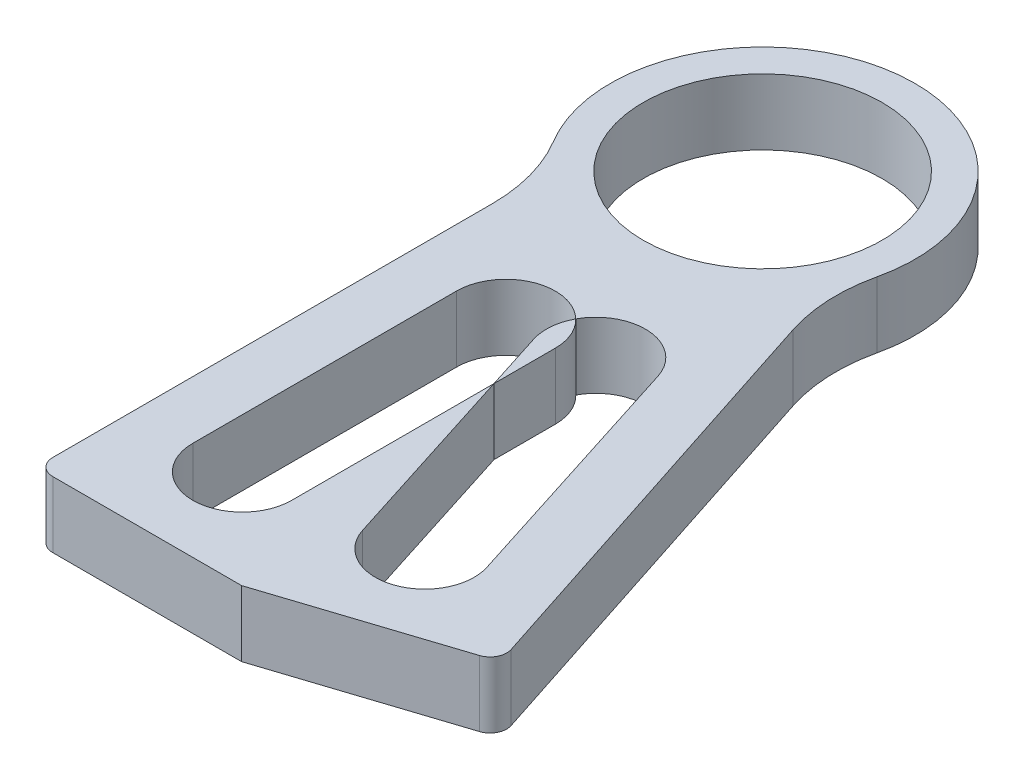
ISO-10303-21;
HEADER;
FILE_DESCRIPTION(('STEP AP214'),'2;1');
FILE_NAME('part.step','',(''),(''),'','','');
FILE_SCHEMA(('AUTOMOTIVE_DESIGN { 1 0 10303 214 1 1 1 1 }'));
ENDSEC;
DATA;
#1=APPLICATION_CONTEXT('core data for automotive mechanical design processes');
#2=APPLICATION_PROTOCOL_DEFINITION('international standard','automotive_design',2000,#1);
#3=PRODUCT_CONTEXT('',#1,'mechanical');
#4=PRODUCT('Part','Part','',(#3));
#5=PRODUCT_RELATED_PRODUCT_CATEGORY('part','',(#4));
#6=PRODUCT_DEFINITION_FORMATION('','',#4);
#7=PRODUCT_DEFINITION_CONTEXT('part definition',#1,'design');
#8=PRODUCT_DEFINITION('design','',#6,#7);
#9=PRODUCT_DEFINITION_SHAPE('','',#8);
#10=(LENGTH_UNIT() NAMED_UNIT(*) SI_UNIT(.MILLI.,.METRE.));
#11=(NAMED_UNIT(*) PLANE_ANGLE_UNIT() SI_UNIT($,.RADIAN.));
#12=(NAMED_UNIT(*) SI_UNIT($,.STERADIAN.) SOLID_ANGLE_UNIT());
#13=UNCERTAINTY_MEASURE_WITH_UNIT(LENGTH_MEASURE(1.E-05),#10,'distance_accuracy_value','');
#14=(GEOMETRIC_REPRESENTATION_CONTEXT(3) GLOBAL_UNCERTAINTY_ASSIGNED_CONTEXT((#13)) GLOBAL_UNIT_ASSIGNED_CONTEXT((#10,
#11,#12)) REPRESENTATION_CONTEXT('',''));
#15=CARTESIAN_POINT('',(0.,0.,0.));
#16=DIRECTION('',(0.,0.,1.));
#17=DIRECTION('',(1.,0.,0.));
#18=AXIS2_PLACEMENT_3D('',#15,#16,#17);
#19=CARTESIAN_POINT('',(0.,6.35,0.));
#20=DIRECTION('',(0.,1.,0.));
#21=DIRECTION('',(0.,0.,1.));
#22=AXIS2_PLACEMENT_3D('',#19,#20,#21);
#23=PLANE('',#22);
#24=CARTESIAN_POINT('',(7.50646694429382,6.35,23.567585157394));
#25=DIRECTION('',(0.,1.,0.));
#26=DIRECTION('',(0.,0.,1.));
#27=AXIS2_PLACEMENT_3D('',#24,#25,#26);
#28=CIRCLE('',#27,4.76250000000001);
#29=CARTESIAN_POINT('',(12.0443479640151,6.35,22.1222332622301));
#30=VERTEX_POINT('',#29);
#31=CARTESIAN_POINT('',(3.31186605310304,6.35,21.3122072259551));
#32=VERTEX_POINT('',#31);
#33=EDGE_CURVE('E246',#30,#32,#28,.T.);
#34=ORIENTED_EDGE('',*,*,#33,.F.);
#35=DIRECTION('',(0.303485962239136,0.,0.952835909652751));
#36=VECTOR('',#35,1.);
#37=CARTESIAN_POINT('',(4.53788101972123,6.35,-1.44535189516389));
#38=LINE('',#37,#36);
#39=CARTESIAN_POINT('',(19.7528914048891,6.35,46.32426536741));
#40=VERTEX_POINT('',#39);
#41=EDGE_CURVE('E248',#30,#40,#38,.T.);
#42=ORIENTED_EDGE('',*,*,#41,.T.);
#43=CARTESIAN_POINT('',(15.2150103851679,6.35,47.7696172625739));
#44=DIRECTION('',(0.,1.,0.));
#45=DIRECTION('',(0.,0.,1.));
#46=AXIS2_PLACEMENT_3D('',#43,#44,#45);
#47=CIRCLE('',#46,4.76250000000001);
#48=CARTESIAN_POINT('',(10.6771293654467,6.35,49.2149691577378));
#49=VERTEX_POINT('',#48);
#50=EDGE_CURVE('E242',#49,#40,#47,.T.);
#51=ORIENTED_EDGE('',*,*,#50,.F.);
#52=DIRECTION('',(0.303485962239136,0.,0.952835909652751));
#53=VECTOR('',#52,1.);
#54=CARTESIAN_POINT('',(-4.53788101972123,6.35,1.44535189516389));
#55=LINE('',#54,#53);
#56=CARTESIAN_POINT('',(4.7625,6.35,30.6451769666791));
#57=VERTEX_POINT('',#56);
#58=EDGE_CURVE('E245',#57,#49,#55,.T.);
#59=ORIENTED_EDGE('',*,*,#58,.F.);
#60=DIRECTION('',(0.,0.,1.));
#61=VECTOR('',#60,1.);
#62=CARTESIAN_POINT('',(4.7625,6.35,0.));
#63=LINE('',#62,#61);
#64=CARTESIAN_POINT('',(4.7625,6.35,50.1346258877065));
#65=VERTEX_POINT('',#64);
#66=EDGE_CURVE('E251',#57,#65,#63,.T.);
#67=ORIENTED_EDGE('',*,*,#66,.T.);
#68=CARTESIAN_POINT('',(0.,6.35,50.1346258877065));
#69=DIRECTION('',(0.,1.,0.));
#70=DIRECTION('',(0.,0.,1.));
#71=AXIS2_PLACEMENT_3D('',#68,#69,#70);
#72=CIRCLE('',#71,4.7625);
#73=CARTESIAN_POINT('',(-4.7625,6.35,50.1346258877065));
#74=VERTEX_POINT('',#73);
#75=EDGE_CURVE('E219',#74,#65,#72,.T.);
#76=ORIENTED_EDGE('',*,*,#75,.F.);
#77=DIRECTION('',(0.,0.,-1.));
#78=VECTOR('',#77,1.);
#79=CARTESIAN_POINT('',(-4.7625,6.35,0.));
#80=LINE('',#79,#78);
#81=CARTESIAN_POINT('',(-4.7625,6.35,24.7346258877065));
#82=VERTEX_POINT('',#81);
#83=EDGE_CURVE('E215',#74,#82,#80,.T.);
#84=ORIENTED_EDGE('',*,*,#83,.T.);
#85=CARTESIAN_POINT('',(0.,6.35,24.7346258877065));
#86=DIRECTION('',(0.,1.,0.));
#87=DIRECTION('',(0.,0.,1.));
#88=AXIS2_PLACEMENT_3D('',#85,#86,#87);
#89=CIRCLE('',#88,4.7625);
#90=EDGE_CURVE('E236',#32,#82,#89,.T.);
#91=ORIENTED_EDGE('',*,*,#90,.F.);
#92=EDGE_LOOP('',(#34,#42,#51,#59,#67,#76,#84,#91));
#93=FACE_BOUND('',#92,.T.);
#94=CARTESIAN_POINT('',(0.,6.35,0.));
#95=DIRECTION('',(0.,1.,0.));
#96=DIRECTION('',(0.,0.,1.));
#97=AXIS2_PLACEMENT_3D('',#94,#95,#96);
#98=CIRCLE('',#97,11.5062);
#99=CARTESIAN_POINT('',(0.,6.35,11.5062));
#100=VERTEX_POINT('',#99);
#101=EDGE_CURVE('E290',#100,#100,#98,.T.);
#102=ORIENTED_EDGE('',*,*,#101,.F.);
#103=EDGE_LOOP('',(#102));
#104=FACE_BOUND('',#103,.T.);
#105=CARTESIAN_POINT('',(0.,6.35,0.));
#106=DIRECTION('',(0.,1.,0.));
#107=DIRECTION('',(0.,0.,1.));
#108=AXIS2_PLACEMENT_3D('',#105,#106,#107);
#109=CIRCLE('',#108,14.6812);
#110=CARTESIAN_POINT('',(14.3078167650456,6.35,3.28998675649024));
#111=VERTEX_POINT('',#110);
#112=CARTESIAN_POINT('',(-12.5882442227764,6.35,7.55471646243172));
#113=VERTEX_POINT('',#112);
#114=EDGE_CURVE('E288',#111,#113,#109,.T.);
#115=ORIENTED_EDGE('',*,*,#114,.T.);
#116=CARTESIAN_POINT('',(-26.2001,6.35,15.723743779075));
#117=DIRECTION('',(0.,1.,0.));
#118=DIRECTION('',(0.,0.,1.));
#119=AXIS2_PLACEMENT_3D('',#116,#117,#118);
#120=CIRCLE('',#119,15.875);
#121=CARTESIAN_POINT('',(-10.3251,6.35,15.723743779075));
#122=VERTEX_POINT('',#121);
#123=EDGE_CURVE('E297',#113,#122,#120,.F.);
#124=ORIENTED_EDGE('',*,*,#123,.T.);
#125=DIRECTION('',(0.,0.,1.));
#126=VECTOR('',#125,1.);
#127=CARTESIAN_POINT('',(-10.3251,6.35,0.));
#128=LINE('',#127,#126);
#129=CARTESIAN_POINT('',(-10.3251,6.35,58.0594258877065));
#130=VERTEX_POINT('',#129);
#131=EDGE_CURVE('E298',#122,#130,#128,.T.);
#132=ORIENTED_EDGE('',*,*,#131,.T.);
#133=CARTESIAN_POINT('',(-8.7249,6.35,58.0594258877065));
#134=DIRECTION('',(0.,1.,0.));
#135=DIRECTION('',(0.,0.,1.));
#136=AXIS2_PLACEMENT_3D('',#133,#134,#135);
#137=CIRCLE('',#136,1.6002);
#138=CARTESIAN_POINT('',(-8.7249,6.35,59.6596258877065));
#139=VERTEX_POINT('',#138);
#140=EDGE_CURVE('E300',#130,#139,#137,.T.);
#141=ORIENTED_EDGE('',*,*,#140,.T.);
#142=DIRECTION('',(1.,0.,0.));
#143=VECTOR('',#142,1.);
#144=CARTESIAN_POINT('',(0.,6.35,59.6596258877065));
#145=LINE('',#144,#143);
#146=CARTESIAN_POINT('',(9.459830418684,6.35,59.6596258877065));
#147=VERTEX_POINT('',#146);
#148=EDGE_CURVE('E301',#139,#147,#145,.T.);
#149=ORIENTED_EDGE('',*,*,#148,.T.);
#150=DIRECTION('',(-0.950948591075739,0.,0.309348956893453));
#151=VECTOR('',#150,1.);
#152=CARTESIAN_POINT('',(18.4556430267213,6.35,56.733237150375));
#153=LINE('',#152,#151);
#154=CARTESIAN_POINT('',(26.7525743889979,6.35,54.0341984363753));
#155=VERTEX_POINT('',#154);
#156=EDGE_CURVE('E305',#155,#147,#153,.T.);
#157=ORIENTED_EDGE('',*,*,#156,.F.);
#158=CARTESIAN_POINT('',(26.257554188177,6.35,52.5124905009359));
#159=DIRECTION('',(0.,1.,0.));
#160=DIRECTION('',(0.,0.,1.));
#161=AXIS2_PLACEMENT_3D('',#158,#159,#160);
#162=CIRCLE('',#161,1.6002);
#163=CARTESIAN_POINT('',(27.7792621236164,6.35,52.017470300115));
#164=VERTEX_POINT('',#163);
#165=EDGE_CURVE('E304',#155,#164,#162,.T.);
#166=ORIENTED_EDGE('',*,*,#165,.T.);
#167=DIRECTION('',(0.309348956893452,0.,0.950948591075739));
#168=VECTOR('',#167,1.);
#169=CARTESIAN_POINT('',(9.81863929771612,6.35,-3.19405891482058));
#170=LINE('',#169,#168);
#171=CARTESIAN_POINT('',(14.6827630342329,6.35,11.7584130783267));
#172=VERTEX_POINT('',#171);
#173=EDGE_CURVE('E282',#172,#164,#170,.T.);
#174=ORIENTED_EDGE('',*,*,#173,.F.);
#175=CARTESIAN_POINT('',(29.7790719175602,6.35,6.84749838764318));
#176=DIRECTION('',(0.,1.,0.));
#177=DIRECTION('',(0.,0.,1.));
#178=AXIS2_PLACEMENT_3D('',#175,#176,#177);
#179=CIRCLE('',#178,15.875);
#180=EDGE_CURVE('E338',#172,#111,#179,.F.);
#181=ORIENTED_EDGE('',*,*,#180,.T.);
#182=EDGE_LOOP('',(#115,#124,#132,#141,#149,#157,#166,#174,#181));
#183=FACE_BOUND('',#182,.T.);
#184=ADVANCED_FACE('F85',(#93,#104,#183),#23,.T.);
#185=CARTESIAN_POINT('',(0.,0.,0.));
#186=DIRECTION('',(0.,1.,0.));
#187=DIRECTION('',(0.,0.,1.));
#188=AXIS2_PLACEMENT_3D('',#185,#186,#187);
#189=PLANE('',#188);
#190=DIRECTION('',(1.,0.,0.));
#191=VECTOR('',#190,1.);
#192=CARTESIAN_POINT('',(0.,0.,59.6596258877065));
#193=LINE('',#192,#191);
#194=CARTESIAN_POINT('',(-8.7249,0.,59.6596258877065));
#195=VERTEX_POINT('',#194);
#196=CARTESIAN_POINT('',(9.459830418684,0.,59.6596258877065));
#197=VERTEX_POINT('',#196);
#198=EDGE_CURVE('E320',#195,#197,#193,.T.);
#199=ORIENTED_EDGE('',*,*,#198,.F.);
#200=CARTESIAN_POINT('',(-8.7249,0.,58.0594258877065));
#201=DIRECTION('',(0.,1.,0.));
#202=DIRECTION('',(0.,0.,1.));
#203=AXIS2_PLACEMENT_3D('',#200,#201,#202);
#204=CIRCLE('',#203,1.6002);
#205=CARTESIAN_POINT('',(-10.3251,0.,58.0594258877065));
#206=VERTEX_POINT('',#205);
#207=EDGE_CURVE('E334',#195,#206,#204,.F.);
#208=ORIENTED_EDGE('',*,*,#207,.T.);
#209=DIRECTION('',(0.,0.,1.));
#210=VECTOR('',#209,1.);
#211=CARTESIAN_POINT('',(-10.3251,0.,0.));
#212=LINE('',#211,#210);
#213=CARTESIAN_POINT('',(-10.3251,0.,15.723743779075));
#214=VERTEX_POINT('',#213);
#215=EDGE_CURVE('E316',#214,#206,#212,.T.);
#216=ORIENTED_EDGE('',*,*,#215,.F.);
#217=CARTESIAN_POINT('',(-26.2001,0.,15.723743779075));
#218=DIRECTION('',(0.,1.,0.));
#219=DIRECTION('',(0.,0.,1.));
#220=AXIS2_PLACEMENT_3D('',#217,#218,#219);
#221=CIRCLE('',#220,15.875);
#222=CARTESIAN_POINT('',(-12.5882442227764,0.,7.55471646243172));
#223=VERTEX_POINT('',#222);
#224=EDGE_CURVE('E337',#214,#223,#221,.T.);
#225=ORIENTED_EDGE('',*,*,#224,.T.);
#226=CARTESIAN_POINT('',(0.,0.,0.));
#227=DIRECTION('',(0.,1.,0.));
#228=DIRECTION('',(0.,0.,1.));
#229=AXIS2_PLACEMENT_3D('',#226,#227,#228);
#230=CIRCLE('',#229,14.6812);
#231=CARTESIAN_POINT('',(14.3078167650456,0.,3.28998675649024));
#232=VERTEX_POINT('',#231);
#233=EDGE_CURVE('E312',#232,#223,#230,.T.);
#234=ORIENTED_EDGE('',*,*,#233,.F.);
#235=CARTESIAN_POINT('',(29.7790719175602,0.,6.84749838764318));
#236=DIRECTION('',(0.,1.,0.));
#237=DIRECTION('',(0.,0.,1.));
#238=AXIS2_PLACEMENT_3D('',#235,#236,#237);
#239=CIRCLE('',#238,15.875);
#240=CARTESIAN_POINT('',(14.6827630342329,0.,11.7584130783267));
#241=VERTEX_POINT('',#240);
#242=EDGE_CURVE('E328',#232,#241,#239,.T.);
#243=ORIENTED_EDGE('',*,*,#242,.T.);
#244=DIRECTION('',(0.309348956893452,0.,0.950948591075739));
#245=VECTOR('',#244,1.);
#246=CARTESIAN_POINT('',(9.81863929771612,0.,-3.19405891482058));
#247=LINE('',#246,#245);
#248=CARTESIAN_POINT('',(27.7792621236164,0.,52.017470300115));
#249=VERTEX_POINT('',#248);
#250=EDGE_CURVE('E326',#241,#249,#247,.T.);
#251=ORIENTED_EDGE('',*,*,#250,.T.);
#252=CARTESIAN_POINT('',(26.257554188177,0.,52.5124905009359));
#253=DIRECTION('',(0.,1.,0.));
#254=DIRECTION('',(0.,0.,1.));
#255=AXIS2_PLACEMENT_3D('',#252,#253,#254);
#256=CIRCLE('',#255,1.6002);
#257=CARTESIAN_POINT('',(26.7525743889979,0.,54.0341984363753));
#258=VERTEX_POINT('',#257);
#259=EDGE_CURVE('E325',#249,#258,#256,.F.);
#260=ORIENTED_EDGE('',*,*,#259,.T.);
#261=DIRECTION('',(-0.950948591075739,0.,0.309348956893453));
#262=VECTOR('',#261,1.);
#263=CARTESIAN_POINT('',(18.4556430267213,0.,56.733237150375));
#264=LINE('',#263,#262);
#265=EDGE_CURVE('E311',#258,#197,#264,.T.);
#266=ORIENTED_EDGE('',*,*,#265,.T.);
#267=EDGE_LOOP('',(#199,#208,#216,#225,#234,#243,#251,#260,#266));
#268=FACE_BOUND('',#267,.T.);
#269=CARTESIAN_POINT('',(0.,0.,0.));
#270=DIRECTION('',(0.,1.,0.));
#271=DIRECTION('',(0.,0.,1.));
#272=AXIS2_PLACEMENT_3D('',#269,#270,#271);
#273=CIRCLE('',#272,11.5062);
#274=CARTESIAN_POINT('',(0.,0.,11.5062));
#275=VERTEX_POINT('',#274);
#276=EDGE_CURVE('E256',#275,#275,#273,.T.);
#277=ORIENTED_EDGE('',*,*,#276,.T.);
#278=EDGE_LOOP('',(#277));
#279=FACE_BOUND('',#278,.T.);
#280=DIRECTION('',(0.303485962239136,0.,0.952835909652751));
#281=VECTOR('',#280,1.);
#282=CARTESIAN_POINT('',(4.53788101972123,0.,-1.44535189516389));
#283=LINE('',#282,#281);
#284=CARTESIAN_POINT('',(12.0443479640151,0.,22.1222332622301));
#285=VERTEX_POINT('',#284);
#286=CARTESIAN_POINT('',(19.7528914048891,0.,46.32426536741));
#287=VERTEX_POINT('',#286);
#288=EDGE_CURVE('E94',#285,#287,#283,.T.);
#289=ORIENTED_EDGE('',*,*,#288,.F.);
#290=CARTESIAN_POINT('',(7.50646694429382,0.,23.567585157394));
#291=DIRECTION('',(0.,1.,0.));
#292=DIRECTION('',(0.,0.,1.));
#293=AXIS2_PLACEMENT_3D('',#290,#291,#292);
#294=CIRCLE('',#293,4.76250000000001);
#295=CARTESIAN_POINT('',(3.31186605310304,0.,21.3122072259551));
#296=VERTEX_POINT('',#295);
#297=EDGE_CURVE('E241',#285,#296,#294,.T.);
#298=ORIENTED_EDGE('',*,*,#297,.T.);
#299=CARTESIAN_POINT('',(0.,0.,24.7346258877065));
#300=DIRECTION('',(0.,1.,0.));
#301=DIRECTION('',(0.,0.,1.));
#302=AXIS2_PLACEMENT_3D('',#299,#300,#301);
#303=CIRCLE('',#302,4.7625);
#304=CARTESIAN_POINT('',(-4.7625,0.,24.7346258877065));
#305=VERTEX_POINT('',#304);
#306=EDGE_CURVE('E229',#296,#305,#303,.T.);
#307=ORIENTED_EDGE('',*,*,#306,.T.);
#308=DIRECTION('',(0.,0.,-1.));
#309=VECTOR('',#308,1.);
#310=CARTESIAN_POINT('',(-4.7625,0.,0.));
#311=LINE('',#310,#309);
#312=CARTESIAN_POINT('',(-4.7625,0.,50.1346258877065));
#313=VERTEX_POINT('',#312);
#314=EDGE_CURVE('E212',#313,#305,#311,.T.);
#315=ORIENTED_EDGE('',*,*,#314,.F.);
#316=CARTESIAN_POINT('',(0.,0.,50.1346258877065));
#317=DIRECTION('',(0.,1.,0.));
#318=DIRECTION('',(0.,0.,1.));
#319=AXIS2_PLACEMENT_3D('',#316,#317,#318);
#320=CIRCLE('',#319,4.7625);
#321=CARTESIAN_POINT('',(4.7625,0.,50.1346258877065));
#322=VERTEX_POINT('',#321);
#323=EDGE_CURVE('E223',#313,#322,#320,.T.);
#324=ORIENTED_EDGE('',*,*,#323,.T.);
#325=DIRECTION('',(0.,0.,1.));
#326=VECTOR('',#325,1.);
#327=CARTESIAN_POINT('',(4.7625,0.,0.));
#328=LINE('',#327,#326);
#329=CARTESIAN_POINT('',(4.7625,0.,30.6451769666791));
#330=VERTEX_POINT('',#329);
#331=EDGE_CURVE('E278',#330,#322,#328,.T.);
#332=ORIENTED_EDGE('',*,*,#331,.F.);
#333=DIRECTION('',(0.303485962239136,0.,0.952835909652751));
#334=VECTOR('',#333,1.);
#335=CARTESIAN_POINT('',(-4.53788101972123,0.,1.44535189516389));
#336=LINE('',#335,#334);
#337=CARTESIAN_POINT('',(10.6771293654467,0.,49.2149691577378));
#338=VERTEX_POINT('',#337);
#339=EDGE_CURVE('E228',#330,#338,#336,.T.);
#340=ORIENTED_EDGE('',*,*,#339,.T.);
#341=CARTESIAN_POINT('',(15.2150103851679,0.,47.7696172625739));
#342=DIRECTION('',(0.,1.,0.));
#343=DIRECTION('',(0.,0.,1.));
#344=AXIS2_PLACEMENT_3D('',#341,#342,#343);
#345=CIRCLE('',#344,4.76250000000001);
#346=EDGE_CURVE('E258',#338,#287,#345,.T.);
#347=ORIENTED_EDGE('',*,*,#346,.T.);
#348=EDGE_LOOP('',(#289,#298,#307,#315,#324,#332,#340,#347));
#349=FACE_BOUND('',#348,.T.);
#350=ADVANCED_FACE('F232',(#268,#279,#349),#189,.F.);
#351=CARTESIAN_POINT('',(0.,6.35,0.));
#352=DIRECTION('',(0.,-1.,0.));
#353=DIRECTION('',(0.,0.,-1.));
#354=AXIS2_PLACEMENT_3D('',#351,#352,#353);
#355=CYLINDRICAL_SURFACE('',#354,14.6812);
#356=ORIENTED_EDGE('',*,*,#114,.F.);
#357=DIRECTION('',(0.,-1.,0.));
#358=VECTOR('',#357,1.);
#359=CARTESIAN_POINT('',(14.3078167650456,6.35,3.28998675649024));
#360=LINE('',#359,#358);
#361=EDGE_CURVE('E261',#111,#232,#360,.T.);
#362=ORIENTED_EDGE('',*,*,#361,.T.);
#363=ORIENTED_EDGE('',*,*,#233,.T.);
#364=DIRECTION('',(0.,-1.,0.));
#365=VECTOR('',#364,1.);
#366=CARTESIAN_POINT('',(-12.5882442227764,6.35,7.55471646243172));
#367=LINE('',#366,#365);
#368=EDGE_CURVE('E315',#223,#113,#367,.F.);
#369=ORIENTED_EDGE('',*,*,#368,.T.);
#370=EDGE_LOOP('',(#356,#362,#363,#369));
#371=FACE_BOUND('',#370,.T.);
#372=ADVANCED_FACE('F372',(#371),#355,.T.);
#373=CARTESIAN_POINT('',(-10.3251,6.35,0.));
#374=DIRECTION('',(1.,0.,0.));
#375=DIRECTION('',(0.,0.,-1.));
#376=AXIS2_PLACEMENT_3D('',#373,#374,#375);
#377=PLANE('',#376);
#378=ORIENTED_EDGE('',*,*,#131,.F.);
#379=DIRECTION('',(0.,1.,0.));
#380=VECTOR('',#379,1.);
#381=CARTESIAN_POINT('',(-10.3251,0.,15.723743779075));
#382=LINE('',#381,#380);
#383=EDGE_CURVE('E319',#122,#214,#382,.F.);
#384=ORIENTED_EDGE('',*,*,#383,.T.);
#385=ORIENTED_EDGE('',*,*,#215,.T.);
#386=DIRECTION('',(0.,-1.,0.));
#387=VECTOR('',#386,1.);
#388=CARTESIAN_POINT('',(-10.3251,6.35,58.0594258877065));
#389=LINE('',#388,#387);
#390=EDGE_CURVE('E318',#206,#130,#389,.F.);
#391=ORIENTED_EDGE('',*,*,#390,.T.);
#392=EDGE_LOOP('',(#378,#384,#385,#391));
#393=FACE_BOUND('',#392,.T.);
#394=ADVANCED_FACE('F362',(#393),#377,.F.);
#395=CARTESIAN_POINT('',(0.,6.35,59.6596258877065));
#396=DIRECTION('',(0.,0.,-1.));
#397=DIRECTION('',(-1.,0.,0.));
#398=AXIS2_PLACEMENT_3D('',#395,#396,#397);
#399=PLANE('',#398);
#400=ORIENTED_EDGE('',*,*,#148,.F.);
#401=DIRECTION('',(0.,-1.,0.));
#402=VECTOR('',#401,1.);
#403=CARTESIAN_POINT('',(-8.7249,6.35,59.6596258877065));
#404=LINE('',#403,#402);
#405=EDGE_CURVE('E323',#139,#195,#404,.T.);
#406=ORIENTED_EDGE('',*,*,#405,.T.);
#407=ORIENTED_EDGE('',*,*,#198,.T.);
#408=DIRECTION('',(0.,-1.,0.));
#409=VECTOR('',#408,1.);
#410=CARTESIAN_POINT('',(9.459830418684,6.35,59.6596258877065));
#411=LINE('',#410,#409);
#412=EDGE_CURVE('E294',#147,#197,#411,.T.);
#413=ORIENTED_EDGE('',*,*,#412,.F.);
#414=EDGE_LOOP('',(#400,#406,#407,#413));
#415=FACE_BOUND('',#414,.T.);
#416=ADVANCED_FACE('F395',(#415),#399,.F.);
#417=CARTESIAN_POINT('',(18.4556430267213,6.35,56.733237150375));
#418=DIRECTION('',(0.309348956893453,0.,0.950948591075739));
#419=DIRECTION('',(0.950948591075739,0.,-0.309348956893453));
#420=AXIS2_PLACEMENT_3D('',#417,#418,#419);
#421=PLANE('',#420);
#422=ORIENTED_EDGE('',*,*,#265,.F.);
#423=DIRECTION('',(0.,-1.,0.));
#424=VECTOR('',#423,1.);
#425=CARTESIAN_POINT('',(26.7525743889979,6.35,54.0341984363753));
#426=LINE('',#425,#424);
#427=EDGE_CURVE('E307',#258,#155,#426,.F.);
#428=ORIENTED_EDGE('',*,*,#427,.T.);
#429=ORIENTED_EDGE('',*,*,#156,.T.);
#430=ORIENTED_EDGE('',*,*,#412,.T.);
#431=EDGE_LOOP('',(#422,#428,#429,#430));
#432=FACE_BOUND('',#431,.T.);
#433=ADVANCED_FACE('F390',(#432),#421,.T.);
#434=CARTESIAN_POINT('',(0.,6.35,0.));
#435=DIRECTION('',(0.,-1.,0.));
#436=DIRECTION('',(0.,0.,-1.));
#437=AXIS2_PLACEMENT_3D('',#434,#435,#436);
#438=CYLINDRICAL_SURFACE('',#437,11.5062);
#439=ORIENTED_EDGE('',*,*,#101,.T.);
#440=EDGE_LOOP('',(#439));
#441=FACE_BOUND('',#440,.T.);
#442=ORIENTED_EDGE('',*,*,#276,.F.);
#443=EDGE_LOOP('',(#442));
#444=FACE_BOUND('',#443,.T.);
#445=ADVANCED_FACE('F406',(#441,#444),#438,.F.);
#446=CARTESIAN_POINT('',(9.81863929771612,6.35,-3.19405891482058));
#447=DIRECTION('',(0.950948591075739,0.,-0.309348956893452));
#448=DIRECTION('',(-0.309348956893452,0.,-0.950948591075739));
#449=AXIS2_PLACEMENT_3D('',#446,#447,#448);
#450=PLANE('',#449);
#451=ORIENTED_EDGE('',*,*,#250,.F.);
#452=DIRECTION('',(0.,-1.,0.));
#453=VECTOR('',#452,1.);
#454=CARTESIAN_POINT('',(14.6827630342329,6.35,11.7584130783267));
#455=LINE('',#454,#453);
#456=EDGE_CURVE('E293',#241,#172,#455,.F.);
#457=ORIENTED_EDGE('',*,*,#456,.T.);
#458=ORIENTED_EDGE('',*,*,#173,.T.);
#459=DIRECTION('',(0.,-1.,0.));
#460=VECTOR('',#459,1.);
#461=CARTESIAN_POINT('',(27.7792621236164,6.35,52.017470300115));
#462=LINE('',#461,#460);
#463=EDGE_CURVE('E279',#164,#249,#462,.T.);
#464=ORIENTED_EDGE('',*,*,#463,.T.);
#465=EDGE_LOOP('',(#451,#457,#458,#464));
#466=FACE_BOUND('',#465,.T.);
#467=ADVANCED_FACE('F381',(#466),#450,.T.);
#468=CARTESIAN_POINT('',(-8.7249,6.35,58.0594258877065));
#469=DIRECTION('',(0.,-1.,0.));
#470=DIRECTION('',(0.,0.,-1.));
#471=AXIS2_PLACEMENT_3D('',#468,#469,#470);
#472=CYLINDRICAL_SURFACE('',#471,1.6002);
#473=ORIENTED_EDGE('',*,*,#140,.F.);
#474=ORIENTED_EDGE('',*,*,#390,.F.);
#475=ORIENTED_EDGE('',*,*,#207,.F.);
#476=ORIENTED_EDGE('',*,*,#405,.F.);
#477=EDGE_LOOP('',(#473,#474,#475,#476));
#478=FACE_BOUND('',#477,.T.);
#479=ADVANCED_FACE('F398',(#478),#472,.T.);
#480=CARTESIAN_POINT('',(26.257554188177,6.35,52.5124905009359));
#481=DIRECTION('',(0.,-1.,0.));
#482=DIRECTION('',(0.,0.,-1.));
#483=AXIS2_PLACEMENT_3D('',#480,#481,#482);
#484=CYLINDRICAL_SURFACE('',#483,1.6002);
#485=ORIENTED_EDGE('',*,*,#165,.F.);
#486=ORIENTED_EDGE('',*,*,#427,.F.);
#487=ORIENTED_EDGE('',*,*,#259,.F.);
#488=ORIENTED_EDGE('',*,*,#463,.F.);
#489=EDGE_LOOP('',(#485,#486,#487,#488));
#490=FACE_BOUND('',#489,.T.);
#491=ADVANCED_FACE('F386',(#490),#484,.T.);
#492=CARTESIAN_POINT('',(29.7790719175602,6.35,6.84749838764318));
#493=DIRECTION('',(0.,-1.,0.));
#494=DIRECTION('',(0.,0.,-1.));
#495=AXIS2_PLACEMENT_3D('',#492,#493,#494);
#496=CYLINDRICAL_SURFACE('',#495,15.875);
#497=ORIENTED_EDGE('',*,*,#180,.F.);
#498=ORIENTED_EDGE('',*,*,#456,.F.);
#499=ORIENTED_EDGE('',*,*,#242,.F.);
#500=ORIENTED_EDGE('',*,*,#361,.F.);
#501=EDGE_LOOP('',(#497,#498,#499,#500));
#502=FACE_BOUND('',#501,.T.);
#503=ADVANCED_FACE('F376',(#502),#496,.F.);
#504=CARTESIAN_POINT('',(-26.2001,6.35,15.723743779075));
#505=DIRECTION('',(0.,-1.,0.));
#506=DIRECTION('',(0.,0.,-1.));
#507=AXIS2_PLACEMENT_3D('',#504,#505,#506);
#508=CYLINDRICAL_SURFACE('',#507,15.875);
#509=ORIENTED_EDGE('',*,*,#123,.F.);
#510=ORIENTED_EDGE('',*,*,#368,.F.);
#511=ORIENTED_EDGE('',*,*,#224,.F.);
#512=ORIENTED_EDGE('',*,*,#383,.F.);
#513=EDGE_LOOP('',(#509,#510,#511,#512));
#514=FACE_BOUND('',#513,.T.);
#515=ADVANCED_FACE('F366',(#514),#508,.F.);
#516=CARTESIAN_POINT('',(4.7625,0.,0.));
#517=DIRECTION('',(-1.,0.,0.));
#518=DIRECTION('',(0.,0.,1.));
#519=AXIS2_PLACEMENT_3D('',#516,#517,#518);
#520=PLANE('',#519);
#521=ORIENTED_EDGE('',*,*,#66,.F.);
#522=DIRECTION('',(0.,1.,0.));
#523=VECTOR('',#522,1.);
#524=CARTESIAN_POINT('',(4.7625,0.,30.6451769666791));
#525=LINE('',#524,#523);
#526=EDGE_CURVE('E253',#330,#57,#525,.T.);
#527=ORIENTED_EDGE('',*,*,#526,.F.);
#528=ORIENTED_EDGE('',*,*,#331,.T.);
#529=DIRECTION('',(0.,1.,0.));
#530=VECTOR('',#529,1.);
#531=CARTESIAN_POINT('',(4.7625,0.,50.1346258877065));
#532=LINE('',#531,#530);
#533=EDGE_CURVE('E225',#322,#65,#532,.T.);
#534=ORIENTED_EDGE('',*,*,#533,.T.);
#535=EDGE_LOOP('',(#521,#527,#528,#534));
#536=FACE_BOUND('',#535,.T.);
#537=ADVANCED_FACE('F271',(#536),#520,.T.);
#538=CARTESIAN_POINT('',(0.,0.,50.1346258877065));
#539=DIRECTION('',(0.,1.,0.));
#540=DIRECTION('',(0.,0.,1.));
#541=AXIS2_PLACEMENT_3D('',#538,#539,#540);
#542=CYLINDRICAL_SURFACE('',#541,4.7625);
#543=ORIENTED_EDGE('',*,*,#75,.T.);
#544=ORIENTED_EDGE('',*,*,#533,.F.);
#545=ORIENTED_EDGE('',*,*,#323,.F.);
#546=DIRECTION('',(0.,1.,0.));
#547=VECTOR('',#546,1.);
#548=CARTESIAN_POINT('',(-4.7625,0.,50.1346258877065));
#549=LINE('',#548,#547);
#550=EDGE_CURVE('E208',#313,#74,#549,.T.);
#551=ORIENTED_EDGE('',*,*,#550,.T.);
#552=EDGE_LOOP('',(#543,#544,#545,#551));
#553=FACE_BOUND('',#552,.T.);
#554=ADVANCED_FACE('F224',(#553),#542,.F.);
#555=CARTESIAN_POINT('',(-4.7625,0.,0.));
#556=DIRECTION('',(1.,0.,0.));
#557=DIRECTION('',(0.,0.,-1.));
#558=AXIS2_PLACEMENT_3D('',#555,#556,#557);
#559=PLANE('',#558);
#560=ORIENTED_EDGE('',*,*,#83,.F.);
#561=ORIENTED_EDGE('',*,*,#550,.F.);
#562=ORIENTED_EDGE('',*,*,#314,.T.);
#563=DIRECTION('',(0.,1.,0.));
#564=VECTOR('',#563,1.);
#565=CARTESIAN_POINT('',(-4.7625,0.,24.7346258877065));
#566=LINE('',#565,#564);
#567=EDGE_CURVE('E234',#305,#82,#566,.T.);
#568=ORIENTED_EDGE('',*,*,#567,.T.);
#569=EDGE_LOOP('',(#560,#561,#562,#568));
#570=FACE_BOUND('',#569,.T.);
#571=ADVANCED_FACE('F210',(#570),#559,.T.);
#572=CARTESIAN_POINT('',(0.,0.,24.7346258877065));
#573=DIRECTION('',(0.,1.,0.));
#574=DIRECTION('',(0.,0.,1.));
#575=AXIS2_PLACEMENT_3D('',#572,#573,#574);
#576=CYLINDRICAL_SURFACE('',#575,4.7625);
#577=ORIENTED_EDGE('',*,*,#90,.T.);
#578=ORIENTED_EDGE('',*,*,#567,.F.);
#579=ORIENTED_EDGE('',*,*,#306,.F.);
#580=DIRECTION('',(0.,1.,0.));
#581=VECTOR('',#580,1.);
#582=CARTESIAN_POINT('',(3.31186605310304,0.,21.3122072259551));
#583=LINE('',#582,#581);
#584=EDGE_CURVE('E88',#296,#32,#583,.T.);
#585=ORIENTED_EDGE('',*,*,#584,.T.);
#586=EDGE_LOOP('',(#577,#578,#579,#585));
#587=FACE_BOUND('',#586,.T.);
#588=ADVANCED_FACE('F421',(#587),#576,.F.);
#589=CARTESIAN_POINT('',(7.50646694429382,0.,23.567585157394));
#590=DIRECTION('',(0.,1.,0.));
#591=DIRECTION('',(0.,0.,1.));
#592=AXIS2_PLACEMENT_3D('',#589,#590,#591);
#593=CYLINDRICAL_SURFACE('',#592,4.76250000000001);
#594=ORIENTED_EDGE('',*,*,#33,.T.);
#595=ORIENTED_EDGE('',*,*,#584,.F.);
#596=ORIENTED_EDGE('',*,*,#297,.F.);
#597=DIRECTION('',(0.,1.,0.));
#598=VECTOR('',#597,1.);
#599=CARTESIAN_POINT('',(12.0443479640151,0.,22.1222332622301));
#600=LINE('',#599,#598);
#601=EDGE_CURVE('E126',#285,#30,#600,.T.);
#602=ORIENTED_EDGE('',*,*,#601,.T.);
#603=EDGE_LOOP('',(#594,#595,#596,#602));
#604=FACE_BOUND('',#603,.T.);
#605=ADVANCED_FACE('F418',(#604),#593,.F.);
#606=CARTESIAN_POINT('',(-4.53788101972123,0.,1.44535189516389));
#607=DIRECTION('',(-0.952835909652751,0.,0.303485962239136));
#608=DIRECTION('',(0.303485962239136,0.,0.952835909652751));
#609=AXIS2_PLACEMENT_3D('',#606,#607,#608);
#610=PLANE('',#609);
#611=ORIENTED_EDGE('',*,*,#58,.T.);
#612=DIRECTION('',(0.,1.,0.));
#613=VECTOR('',#612,1.);
#614=CARTESIAN_POINT('',(10.6771293654467,0.,49.2149691577378));
#615=LINE('',#614,#613);
#616=EDGE_CURVE('E119',#338,#49,#615,.T.);
#617=ORIENTED_EDGE('',*,*,#616,.F.);
#618=ORIENTED_EDGE('',*,*,#339,.F.);
#619=ORIENTED_EDGE('',*,*,#526,.T.);
#620=EDGE_LOOP('',(#611,#617,#618,#619));
#621=FACE_BOUND('',#620,.T.);
#622=ADVANCED_FACE('F266',(#621),#610,.F.);
#623=CARTESIAN_POINT('',(15.2150103851679,0.,47.7696172625739));
#624=DIRECTION('',(0.,1.,0.));
#625=DIRECTION('',(0.,0.,1.));
#626=AXIS2_PLACEMENT_3D('',#623,#624,#625);
#627=CYLINDRICAL_SURFACE('',#626,4.76250000000001);
#628=ORIENTED_EDGE('',*,*,#50,.T.);
#629=DIRECTION('',(0.,1.,0.));
#630=VECTOR('',#629,1.);
#631=CARTESIAN_POINT('',(19.7528914048891,0.,46.32426536741));
#632=LINE('',#631,#630);
#633=EDGE_CURVE('E13',#287,#40,#632,.T.);
#634=ORIENTED_EDGE('',*,*,#633,.F.);
#635=ORIENTED_EDGE('',*,*,#346,.F.);
#636=ORIENTED_EDGE('',*,*,#616,.T.);
#637=EDGE_LOOP('',(#628,#634,#635,#636));
#638=FACE_BOUND('',#637,.T.);
#639=ADVANCED_FACE('F277',(#638),#627,.F.);
#640=CARTESIAN_POINT('',(4.53788101972123,0.,-1.44535189516389));
#641=DIRECTION('',(-0.952835909652751,0.,0.303485962239136));
#642=DIRECTION('',(0.303485962239136,0.,0.952835909652751));
#643=AXIS2_PLACEMENT_3D('',#640,#641,#642);
#644=PLANE('',#643);
#645=ORIENTED_EDGE('',*,*,#41,.F.);
#646=ORIENTED_EDGE('',*,*,#601,.F.);
#647=ORIENTED_EDGE('',*,*,#288,.T.);
#648=ORIENTED_EDGE('',*,*,#633,.T.);
#649=EDGE_LOOP('',(#645,#646,#647,#648));
#650=FACE_BOUND('',#649,.T.);
#651=ADVANCED_FACE('F422',(#650),#644,.T.);
#652=CLOSED_SHELL('',(#184,#350,#372,#394,#416,#433,#445,#467,#479,#491,#503,#515,#537,#554,
#571,#588,#605,#622,#639,#651));
#653=MANIFOLD_SOLID_BREP('B2',#652);
#654=CARTESIAN_POINT('',(7.50646694429382,0.,23.567585157394));
#655=DIRECTION('',(0.,1.,0.));
#656=DIRECTION('',(0.,0.,1.));
#657=AXIS2_PLACEMENT_3D('',#654,#655,#656);
#658=CYLINDRICAL_SURFACE('',#657,4.76250000000001);
#659=CARTESIAN_POINT('',(7.50646694429382,6.35,23.567585157394));
#660=DIRECTION('',(0.,1.,0.));
#661=DIRECTION('',(0.,0.,1.));
#662=AXIS2_PLACEMENT_3D('',#659,#660,#661);
#663=CIRCLE('',#662,4.76250000000001);
#664=CARTESIAN_POINT('',(3.31186605310304,6.35,21.3122072259551));
#665=VERTEX_POINT('',#664);
#666=CARTESIAN_POINT('',(2.96858592457259,6.35,25.0129370525579));
#667=VERTEX_POINT('',#666);
#668=EDGE_CURVE('E693',#665,#667,#663,.T.);
#669=ORIENTED_EDGE('',*,*,#668,.F.);
#670=DIRECTION('',(0.,1.,0.));
#671=VECTOR('',#670,1.);
#672=CARTESIAN_POINT('',(3.31186605310304,0.,21.3122072259551));
#673=LINE('',#672,#671);
#674=CARTESIAN_POINT('',(3.31186605310304,0.,21.3122072259551));
#675=VERTEX_POINT('',#674);
#676=EDGE_CURVE('E650',#675,#665,#673,.T.);
#677=ORIENTED_EDGE('',*,*,#676,.F.);
#678=CARTESIAN_POINT('',(7.50646694429382,0.,23.567585157394));
#679=DIRECTION('',(0.,1.,0.));
#680=DIRECTION('',(0.,0.,1.));
#681=AXIS2_PLACEMENT_3D('',#678,#679,#680);
#682=CIRCLE('',#681,4.76250000000001);
#683=CARTESIAN_POINT('',(2.96858592457259,0.,25.0129370525579));
#684=VERTEX_POINT('',#683);
#685=EDGE_CURVE('E702',#675,#684,#682,.T.);
#686=ORIENTED_EDGE('',*,*,#685,.T.);
#687=DIRECTION('',(0.,1.,0.));
#688=VECTOR('',#687,1.);
#689=CARTESIAN_POINT('',(2.96858592457259,0.,25.0129370525579));
#690=LINE('',#689,#688);
#691=EDGE_CURVE('E83',#684,#667,#690,.T.);
#692=ORIENTED_EDGE('',*,*,#691,.T.);
#693=EDGE_LOOP('',(#669,#677,#686,#692));
#694=FACE_BOUND('',#693,.T.);
#695=ADVANCED_FACE('F646',(#694),#658,.T.);
#696=CARTESIAN_POINT('',(-4.53788101972123,0.,1.44535189516389));
#697=DIRECTION('',(-0.952835909652751,0.,0.303485962239136));
#698=DIRECTION('',(0.303485962239136,0.,0.952835909652751));
#699=AXIS2_PLACEMENT_3D('',#696,#697,#698);
#700=PLANE('',#699);
#701=DIRECTION('',(0.303485962239136,0.,0.952835909652751));
#702=VECTOR('',#701,1.);
#703=CARTESIAN_POINT('',(-4.53788101972123,6.35,1.44535189516389));
#704=LINE('',#703,#702);
#705=CARTESIAN_POINT('',(4.7625,6.35,30.6451769666791));
#706=VERTEX_POINT('',#705);
#707=EDGE_CURVE('E710',#667,#706,#704,.T.);
#708=ORIENTED_EDGE('',*,*,#707,.F.);
#709=ORIENTED_EDGE('',*,*,#691,.F.);
#710=DIRECTION('',(0.303485962239136,0.,0.952835909652751));
#711=VECTOR('',#710,1.);
#712=CARTESIAN_POINT('',(-4.53788101972123,0.,1.44535189516389));
#713=LINE('',#712,#711);
#714=CARTESIAN_POINT('',(4.7625,0.,30.6451769666791));
#715=VERTEX_POINT('',#714);
#716=EDGE_CURVE('E709',#684,#715,#713,.T.);
#717=ORIENTED_EDGE('',*,*,#716,.T.);
#718=DIRECTION('',(0.,1.,0.));
#719=VECTOR('',#718,1.);
#720=CARTESIAN_POINT('',(4.7625,0.,30.6451769666791));
#721=LINE('',#720,#719);
#722=EDGE_CURVE('E655',#715,#706,#721,.T.);
#723=ORIENTED_EDGE('',*,*,#722,.T.);
#724=EDGE_LOOP('',(#708,#709,#717,#723));
#725=FACE_BOUND('',#724,.T.);
#726=ADVANCED_FACE('F716',(#725),#700,.T.);
#727=CARTESIAN_POINT('',(0.,0.,0.));
#728=DIRECTION('',(0.,1.,0.));
#729=DIRECTION('',(0.,0.,1.));
#730=AXIS2_PLACEMENT_3D('',#727,#728,#729);
#731=PLANE('',#730);
#732=CARTESIAN_POINT('',(0.,0.,24.7346258877065));
#733=DIRECTION('',(0.,1.,0.));
#734=DIRECTION('',(0.,0.,1.));
#735=AXIS2_PLACEMENT_3D('',#732,#733,#734);
#736=CIRCLE('',#735,4.7625);
#737=CARTESIAN_POINT('',(4.7625,0.,24.7346258877065));
#738=VERTEX_POINT('',#737);
#739=EDGE_CURVE('E689',#738,#675,#736,.T.);
#740=ORIENTED_EDGE('',*,*,#739,.F.);
#741=DIRECTION('',(0.,0.,1.));
#742=VECTOR('',#741,1.);
#743=CARTESIAN_POINT('',(4.7625,0.,0.));
#744=LINE('',#743,#742);
#745=EDGE_CURVE('E694',#738,#715,#744,.T.);
#746=ORIENTED_EDGE('',*,*,#745,.T.);
#747=ORIENTED_EDGE('',*,*,#716,.F.);
#748=ORIENTED_EDGE('',*,*,#685,.F.);
#749=EDGE_LOOP('',(#740,#746,#747,#748));
#750=FACE_BOUND('',#749,.T.);
#751=ADVANCED_FACE('F648',(#750),#731,.F.);
#752=CARTESIAN_POINT('',(0.,6.35,0.));
#753=DIRECTION('',(0.,1.,0.));
#754=DIRECTION('',(0.,0.,1.));
#755=AXIS2_PLACEMENT_3D('',#752,#753,#754);
#756=PLANE('',#755);
#757=DIRECTION('',(0.,0.,1.));
#758=VECTOR('',#757,1.);
#759=CARTESIAN_POINT('',(4.7625,6.35,0.));
#760=LINE('',#759,#758);
#761=CARTESIAN_POINT('',(4.7625,6.35,24.7346258877065));
#762=VERTEX_POINT('',#761);
#763=EDGE_CURVE('E703',#762,#706,#760,.T.);
#764=ORIENTED_EDGE('',*,*,#763,.F.);
#765=CARTESIAN_POINT('',(0.,6.35,24.7346258877065));
#766=DIRECTION('',(0.,1.,0.));
#767=DIRECTION('',(0.,0.,1.));
#768=AXIS2_PLACEMENT_3D('',#765,#766,#767);
#769=CIRCLE('',#768,4.7625);
#770=EDGE_CURVE('E691',#762,#665,#769,.T.);
#771=ORIENTED_EDGE('',*,*,#770,.T.);
#772=ORIENTED_EDGE('',*,*,#668,.T.);
#773=ORIENTED_EDGE('',*,*,#707,.T.);
#774=EDGE_LOOP('',(#764,#771,#772,#773));
#775=FACE_BOUND('',#774,.T.);
#776=ADVANCED_FACE('F719',(#775),#756,.T.);
#777=CARTESIAN_POINT('',(0.,0.,24.7346258877065));
#778=DIRECTION('',(0.,1.,0.));
#779=DIRECTION('',(0.,0.,1.));
#780=AXIS2_PLACEMENT_3D('',#777,#778,#779);
#781=CYLINDRICAL_SURFACE('',#780,4.7625);
#782=ORIENTED_EDGE('',*,*,#770,.F.);
#783=DIRECTION('',(0.,1.,0.));
#784=VECTOR('',#783,1.);
#785=CARTESIAN_POINT('',(4.7625,0.,24.7346258877065));
#786=LINE('',#785,#784);
#787=EDGE_CURVE('E686',#738,#762,#786,.T.);
#788=ORIENTED_EDGE('',*,*,#787,.F.);
#789=ORIENTED_EDGE('',*,*,#739,.T.);
#790=ORIENTED_EDGE('',*,*,#676,.T.);
#791=EDGE_LOOP('',(#782,#788,#789,#790));
#792=FACE_BOUND('',#791,.T.);
#793=ADVANCED_FACE('F687',(#792),#781,.T.);
#794=CARTESIAN_POINT('',(4.7625,0.,0.));
#795=DIRECTION('',(-1.,0.,0.));
#796=DIRECTION('',(0.,0.,1.));
#797=AXIS2_PLACEMENT_3D('',#794,#795,#796);
#798=PLANE('',#797);
#799=ORIENTED_EDGE('',*,*,#763,.T.);
#800=ORIENTED_EDGE('',*,*,#722,.F.);
#801=ORIENTED_EDGE('',*,*,#745,.F.);
#802=ORIENTED_EDGE('',*,*,#787,.T.);
#803=EDGE_LOOP('',(#799,#800,#801,#802));
#804=FACE_BOUND('',#803,.T.);
#805=ADVANCED_FACE('F697',(#804),#798,.F.);
#806=CLOSED_SHELL('',(#695,#726,#751,#776,#793,#805));
#807=MANIFOLD_SOLID_BREP('B7',#806);
#808=ADVANCED_BREP_SHAPE_REPRESENTATION('',(#18,#653,#807),#14);
#809=SHAPE_DEFINITION_REPRESENTATION(#9,#808);
ENDSEC;
END-ISO-10303-21;
